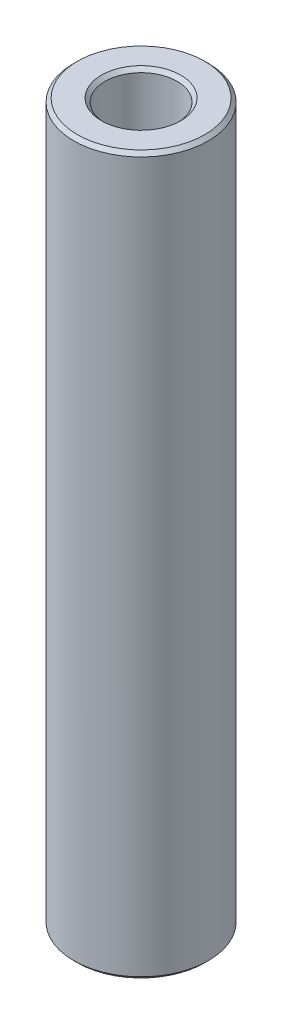
ISO-10303-21;
HEADER;
FILE_DESCRIPTION(('STEP AP214'),'2;1');
FILE_NAME('part.step','',(''),(''),'','','');
FILE_SCHEMA(('AUTOMOTIVE_DESIGN { 1 0 10303 214 1 1 1 1 }'));
ENDSEC;
DATA;
#1=APPLICATION_CONTEXT('core data for automotive mechanical design processes');
#2=APPLICATION_PROTOCOL_DEFINITION('international standard','automotive_design',2000,#1);
#3=PRODUCT_CONTEXT('',#1,'mechanical');
#4=PRODUCT('Part','Part','',(#3));
#5=PRODUCT_RELATED_PRODUCT_CATEGORY('part','',(#4));
#6=PRODUCT_DEFINITION_FORMATION('','',#4);
#7=PRODUCT_DEFINITION_CONTEXT('part definition',#1,'design');
#8=PRODUCT_DEFINITION('design','',#6,#7);
#9=PRODUCT_DEFINITION_SHAPE('','',#8);
#10=(LENGTH_UNIT() NAMED_UNIT(*) SI_UNIT(.MILLI.,.METRE.));
#11=(NAMED_UNIT(*) PLANE_ANGLE_UNIT() SI_UNIT($,.RADIAN.));
#12=(NAMED_UNIT(*) SI_UNIT($,.STERADIAN.) SOLID_ANGLE_UNIT());
#13=UNCERTAINTY_MEASURE_WITH_UNIT(LENGTH_MEASURE(1.E-05),#10,'distance_accuracy_value','');
#14=(GEOMETRIC_REPRESENTATION_CONTEXT(3) GLOBAL_UNCERTAINTY_ASSIGNED_CONTEXT((#13)) GLOBAL_UNIT_ASSIGNED_CONTEXT((#10,
#11,#12)) REPRESENTATION_CONTEXT('',''));
#15=CARTESIAN_POINT('',(0.,0.,0.));
#16=DIRECTION('',(0.,0.,1.));
#17=DIRECTION('',(1.,0.,0.));
#18=AXIS2_PLACEMENT_3D('',#15,#16,#17);
#19=CARTESIAN_POINT('',(0.,50.8,0.));
#20=DIRECTION('',(0.,-1.,0.));
#21=DIRECTION('',(0.,0.,-1.));
#22=AXIS2_PLACEMENT_3D('',#19,#20,#21);
#23=CYLINDRICAL_SURFACE('',#22,2.5527);
#24=CARTESIAN_POINT('',(0.,50.5460000000539,0.));
#25=DIRECTION('',(0.,1.,0.));
#26=DIRECTION('',(0.,0.,1.));
#27=AXIS2_PLACEMENT_3D('',#24,#25,#26);
#28=CIRCLE('',#27,2.55270000002383);
#29=CARTESIAN_POINT('',(0.,50.5460000000539,2.55270000002383));
#30=VERTEX_POINT('',#29);
#31=EDGE_CURVE('E34',#30,#30,#28,.T.);
#32=ORIENTED_EDGE('',*,*,#31,.T.);
#33=EDGE_LOOP('',(#32));
#34=FACE_BOUND('',#33,.T.);
#35=CARTESIAN_POINT('',(0.,0.254000000040833,0.));
#36=DIRECTION('',(0.,-1.,0.));
#37=DIRECTION('',(0.,0.,-1.));
#38=AXIS2_PLACEMENT_3D('',#35,#36,#37);
#39=CIRCLE('',#38,2.55269999996699);
#40=CARTESIAN_POINT('',(0.,0.254000000040833,-2.55269999996699));
#41=VERTEX_POINT('',#40);
#42=EDGE_CURVE('E38',#41,#41,#39,.T.);
#43=ORIENTED_EDGE('',*,*,#42,.T.);
#44=EDGE_LOOP('',(#43));
#45=FACE_BOUND('',#44,.T.);
#46=ADVANCED_FACE('F15',(#34,#45),#23,.F.);
#47=CARTESIAN_POINT('',(0.,5.6843418860808E-11,0.));
#48=DIRECTION('',(0.,-1.,0.));
#49=DIRECTION('',(0.,0.,-1.));
#50=AXIS2_PLACEMENT_3D('',#47,#48,#49);
#51=CONICAL_SURFACE('',#50,2.80669999995098,0.785398163397448);
#52=CARTESIAN_POINT('',(0.,-5.6843418860808E-11,0.));
#53=DIRECTION('',(0.,-1.,0.));
#54=DIRECTION('',(0.,0.,-1.));
#55=AXIS2_PLACEMENT_3D('',#52,#53,#54);
#56=CIRCLE('',#55,2.80670000006467);
#57=CARTESIAN_POINT('',(0.,-5.6843418860808E-11,-2.80670000006467));
#58=VERTEX_POINT('',#57);
#59=EDGE_CURVE('E37',#58,#58,#56,.T.);
#60=ORIENTED_EDGE('',*,*,#59,.T.);
#61=EDGE_LOOP('',(#60));
#62=FACE_BOUND('',#61,.T.);
#63=ORIENTED_EDGE('',*,*,#42,.F.);
#64=EDGE_LOOP('',(#63));
#65=FACE_BOUND('',#64,.T.);
#66=ADVANCED_FACE('F61',(#62,#65),#51,.F.);
#67=CARTESIAN_POINT('',(0.,50.8000000000379,0.));
#68=DIRECTION('',(0.,1.,0.));
#69=DIRECTION('',(0.,0.,1.));
#70=AXIS2_PLACEMENT_3D('',#67,#68,#69);
#71=CONICAL_SURFACE('',#70,2.80670000000782,0.785398163397448);
#72=ORIENTED_EDGE('',*,*,#31,.F.);
#73=EDGE_LOOP('',(#72));
#74=FACE_BOUND('',#73,.T.);
#75=CARTESIAN_POINT('',(0.,50.8000000000379,0.));
#76=DIRECTION('',(0.,1.,0.));
#77=DIRECTION('',(0.,0.,1.));
#78=AXIS2_PLACEMENT_3D('',#75,#76,#77);
#79=CIRCLE('',#78,2.80670000000782);
#80=CARTESIAN_POINT('',(0.,50.8000000000379,2.80670000000782));
#81=VERTEX_POINT('',#80);
#82=EDGE_CURVE('E52',#81,#81,#79,.F.);
#83=ORIENTED_EDGE('',*,*,#82,.F.);
#84=EDGE_LOOP('',(#83));
#85=FACE_BOUND('',#84,.T.);
#86=ADVANCED_FACE('F67',(#74,#85),#71,.F.);
#87=CARTESIAN_POINT('',(0.,0.,0.));
#88=DIRECTION('',(0.,1.,0.));
#89=DIRECTION('',(0.,0.,1.));
#90=AXIS2_PLACEMENT_3D('',#87,#88,#89);
#91=PLANE('',#90);
#92=CARTESIAN_POINT('',(0.,0.,0.));
#93=DIRECTION('',(0.,1.,0.));
#94=DIRECTION('',(0.,0.,1.));
#95=AXIS2_PLACEMENT_3D('',#92,#93,#94);
#96=CIRCLE('',#95,4.50850000004266);
#97=CARTESIAN_POINT('',(0.,0.,4.50850000004266));
#98=VERTEX_POINT('',#97);
#99=EDGE_CURVE('E47',#98,#98,#96,.T.);
#100=ORIENTED_EDGE('',*,*,#99,.F.);
#101=EDGE_LOOP('',(#100));
#102=FACE_BOUND('',#101,.T.);
#103=ORIENTED_EDGE('',*,*,#59,.F.);
#104=EDGE_LOOP('',(#103));
#105=FACE_BOUND('',#104,.T.);
#106=ADVANCED_FACE('F64',(#102,#105),#91,.F.);
#107=CARTESIAN_POINT('',(0.,50.8,0.));
#108=DIRECTION('',(0.,1.,0.));
#109=DIRECTION('',(0.,0.,1.));
#110=AXIS2_PLACEMENT_3D('',#107,#108,#109);
#111=PLANE('',#110);
#112=CARTESIAN_POINT('',(0.,50.7999999999811,0.));
#113=DIRECTION('',(0.,-1.,0.));
#114=DIRECTION('',(1.,0.,0.));
#115=AXIS2_PLACEMENT_3D('',#112,#113,#114);
#116=CIRCLE('',#115,4.50850000004266);
#117=CARTESIAN_POINT('',(4.50850000004266,50.7999999999811,0.));
#118=VERTEX_POINT('',#117);
#119=EDGE_CURVE('E27',#118,#118,#116,.T.);
#120=ORIENTED_EDGE('',*,*,#119,.F.);
#121=EDGE_LOOP('',(#120));
#122=FACE_BOUND('',#121,.T.);
#123=ORIENTED_EDGE('',*,*,#82,.T.);
#124=EDGE_LOOP('',(#123));
#125=FACE_BOUND('',#124,.T.);
#126=ADVANCED_FACE('F66',(#122,#125),#111,.T.);
#127=CARTESIAN_POINT('',(0.,0.253999999983989,0.));
#128=DIRECTION('',(0.,1.,0.));
#129=DIRECTION('',(0.,0.,1.));
#130=AXIS2_PLACEMENT_3D('',#127,#128,#129);
#131=CONICAL_SURFACE('',#130,4.76250000002665,0.785398163397448);
#132=CARTESIAN_POINT('',(0.,0.253999999999997,0.));
#133=DIRECTION('',(0.,-1.,0.));
#134=DIRECTION('',(0.,0.,-1.));
#135=AXIS2_PLACEMENT_3D('',#132,#133,#134);
#136=CIRCLE('',#135,4.7625);
#137=CARTESIAN_POINT('',(0.,0.253999999999997,-4.7625));
#138=VERTEX_POINT('',#137);
#139=EDGE_CURVE('E22',#138,#138,#136,.F.);
#140=ORIENTED_EDGE('',*,*,#139,.F.);
#141=EDGE_LOOP('',(#140));
#142=FACE_BOUND('',#141,.T.);
#143=ORIENTED_EDGE('',*,*,#99,.T.);
#144=EDGE_LOOP('',(#143));
#145=FACE_BOUND('',#144,.T.);
#146=ADVANCED_FACE('F75',(#142,#145),#131,.T.);
#147=CARTESIAN_POINT('',(0.,50.5460000000539,0.));
#148=DIRECTION('',(0.,-1.,0.));
#149=DIRECTION('',(1.,0.,0.));
#150=AXIS2_PLACEMENT_3D('',#147,#148,#149);
#151=CONICAL_SURFACE('',#150,4.76249999991296,0.785398163285552);
#152=ORIENTED_EDGE('',*,*,#119,.T.);
#153=EDGE_LOOP('',(#152));
#154=FACE_BOUND('',#153,.T.);
#155=CARTESIAN_POINT('',(0.,50.546,0.));
#156=DIRECTION('',(0.,-1.,0.));
#157=DIRECTION('',(0.,0.,-1.));
#158=AXIS2_PLACEMENT_3D('',#155,#156,#157);
#159=CIRCLE('',#158,4.7625);
#160=CARTESIAN_POINT('',(0.,50.546,-4.7625));
#161=VERTEX_POINT('',#160);
#162=EDGE_CURVE('E10',#161,#161,#159,.T.);
#163=ORIENTED_EDGE('',*,*,#162,.F.);
#164=EDGE_LOOP('',(#163));
#165=FACE_BOUND('',#164,.T.);
#166=ADVANCED_FACE('F83',(#154,#165),#151,.T.);
#167=CARTESIAN_POINT('',(0.,50.8,0.));
#168=DIRECTION('',(0.,-1.,0.));
#169=DIRECTION('',(0.,0.,-1.));
#170=AXIS2_PLACEMENT_3D('',#167,#168,#169);
#171=CYLINDRICAL_SURFACE('',#170,4.7625);
#172=ORIENTED_EDGE('',*,*,#162,.T.);
#173=EDGE_LOOP('',(#172));
#174=FACE_BOUND('',#173,.T.);
#175=ORIENTED_EDGE('',*,*,#139,.T.);
#176=EDGE_LOOP('',(#175));
#177=FACE_BOUND('',#176,.T.);
#178=ADVANCED_FACE('F81',(#174,#177),#171,.T.);
#179=CLOSED_SHELL('',(#46,#66,#86,#106,#126,#146,#166,#178));
#180=MANIFOLD_SOLID_BREP('B1',#179);
#181=ADVANCED_BREP_SHAPE_REPRESENTATION('',(#18,#180),#14);
#182=SHAPE_DEFINITION_REPRESENTATION(#9,#181);
ENDSEC;
END-ISO-10303-21;
